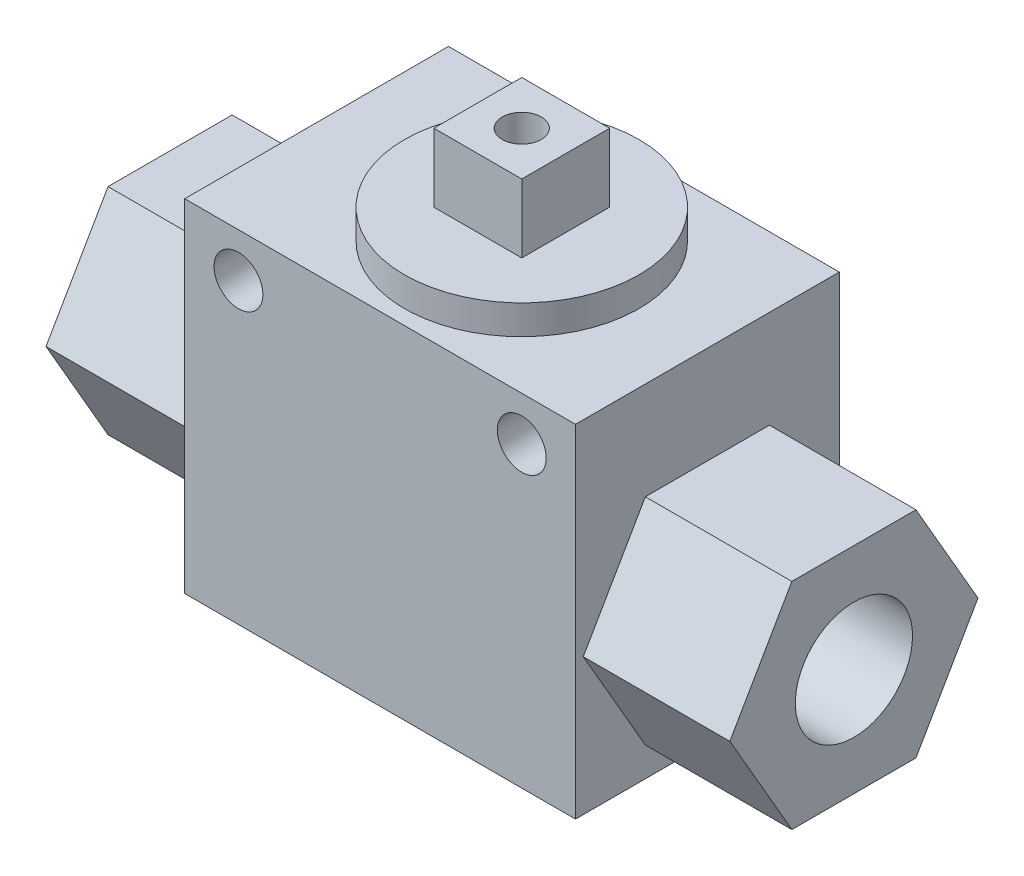
ISO-10303-21;
HEADER;
FILE_DESCRIPTION(('STEP AP214'),'2;1');
FILE_NAME('part.step','',(''),(''),'','','');
FILE_SCHEMA(('AUTOMOTIVE_DESIGN { 1 0 10303 214 1 1 1 1 }'));
ENDSEC;
DATA;
#1=APPLICATION_CONTEXT('core data for automotive mechanical design processes');
#2=APPLICATION_PROTOCOL_DEFINITION('international standard','automotive_design',2000,#1);
#3=PRODUCT_CONTEXT('',#1,'mechanical');
#4=PRODUCT('Part','Part','',(#3));
#5=PRODUCT_RELATED_PRODUCT_CATEGORY('part','',(#4));
#6=PRODUCT_DEFINITION_FORMATION('','',#4);
#7=PRODUCT_DEFINITION_CONTEXT('part definition',#1,'design');
#8=PRODUCT_DEFINITION('design','',#6,#7);
#9=PRODUCT_DEFINITION_SHAPE('','',#8);
#10=(LENGTH_UNIT() NAMED_UNIT(*) SI_UNIT(.MILLI.,.METRE.));
#11=(NAMED_UNIT(*) PLANE_ANGLE_UNIT() SI_UNIT($,.RADIAN.));
#12=(NAMED_UNIT(*) SI_UNIT($,.STERADIAN.) SOLID_ANGLE_UNIT());
#13=UNCERTAINTY_MEASURE_WITH_UNIT(LENGTH_MEASURE(1.E-05),#10,'distance_accuracy_value','');
#14=(GEOMETRIC_REPRESENTATION_CONTEXT(3) GLOBAL_UNCERTAINTY_ASSIGNED_CONTEXT((#13)) GLOBAL_UNIT_ASSIGNED_CONTEXT((#10,
#11,#12)) REPRESENTATION_CONTEXT('',''));
#15=CARTESIAN_POINT('',(0.,0.,0.));
#16=DIRECTION('',(0.,0.,1.));
#17=DIRECTION('',(1.,0.,0.));
#18=AXIS2_PLACEMENT_3D('',#15,#16,#17);
#19=CARTESIAN_POINT('',(0.,0.,-13.5));
#20=DIRECTION('',(-1.,0.,0.));
#21=DIRECTION('',(0.,-1.,0.));
#22=AXIS2_PLACEMENT_3D('',#19,#20,#21);
#23=PLANE('',#22);
#24=CARTESIAN_POINT('',(0.,14.,0.));
#25=DIRECTION('',(1.,0.,0.));
#26=DIRECTION('',(0.,0.,-1.));
#27=AXIS2_PLACEMENT_3D('',#24,#25,#26);
#28=CIRCLE('',#27,3.);
#29=CARTESIAN_POINT('',(0.,14.,-3.));
#30=VERTEX_POINT('',#29);
#31=EDGE_CURVE('E324',#30,#30,#28,.T.);
#32=ORIENTED_EDGE('',*,*,#31,.T.);
#33=EDGE_LOOP('',(#32));
#34=FACE_BOUND('',#33,.T.);
#35=CARTESIAN_POINT('',(0.,14.,0.));
#36=DIRECTION('',(1.,0.,0.));
#37=DIRECTION('',(0.,0.,-1.));
#38=AXIS2_PLACEMENT_3D('',#35,#36,#37);
#39=CIRCLE('',#38,6.);
#40=CARTESIAN_POINT('',(0.,14.,-6.));
#41=VERTEX_POINT('',#40);
#42=EDGE_CURVE('E54',#41,#41,#39,.T.);
#43=ORIENTED_EDGE('',*,*,#42,.F.);
#44=EDGE_LOOP('',(#43));
#45=FACE_BOUND('',#44,.T.);
#46=ADVANCED_FACE('F45',(#34,#45),#23,.T.);
#47=CARTESIAN_POINT('',(0.,0.,-13.5));
#48=DIRECTION('',(0.,-1.,0.));
#49=DIRECTION('',(0.,0.,-1.));
#50=AXIS2_PLACEMENT_3D('',#47,#48,#49);
#51=PLANE('',#50);
#52=DIRECTION('',(0.,0.,1.));
#53=VECTOR('',#52,1.);
#54=CARTESIAN_POINT('',(40.,0.,-13.5));
#55=LINE('',#54,#53);
#56=CARTESIAN_POINT('',(40.,0.,-13.5));
#57=VERTEX_POINT('',#56);
#58=CARTESIAN_POINT('',(40.,0.,13.5));
#59=VERTEX_POINT('',#58);
#60=EDGE_CURVE('E450',#57,#59,#55,.T.);
#61=ORIENTED_EDGE('',*,*,#60,.T.);
#62=DIRECTION('',(1.,0.,0.));
#63=VECTOR('',#62,1.);
#64=CARTESIAN_POINT('',(0.,0.,13.5));
#65=LINE('',#64,#63);
#66=CARTESIAN_POINT('',(0.,0.,13.5));
#67=VERTEX_POINT('',#66);
#68=EDGE_CURVE('E411',#67,#59,#65,.T.);
#69=ORIENTED_EDGE('',*,*,#68,.F.);
#70=DIRECTION('',(0.,0.,1.));
#71=VECTOR('',#70,1.);
#72=CARTESIAN_POINT('',(0.,0.,-13.5));
#73=LINE('',#72,#71);
#74=CARTESIAN_POINT('',(0.,0.,-13.5));
#75=VERTEX_POINT('',#74);
#76=EDGE_CURVE('E305',#75,#67,#73,.T.);
#77=ORIENTED_EDGE('',*,*,#76,.F.);
#78=DIRECTION('',(1.,0.,0.));
#79=VECTOR('',#78,1.);
#80=CARTESIAN_POINT('',(0.,0.,-13.5));
#81=LINE('',#80,#79);
#82=EDGE_CURVE('E435',#75,#57,#81,.T.);
#83=ORIENTED_EDGE('',*,*,#82,.T.);
#84=EDGE_LOOP('',(#61,#69,#77,#83));
#85=FACE_BOUND('',#84,.T.);
#86=ADVANCED_FACE('F462',(#85),#51,.T.);
#87=DIRECTION('',(0.,0.,1.));
#88=VECTOR('',#87,1.);
#89=CARTESIAN_POINT('',(0.,25.,0.));
#90=LINE('',#89,#88);
#91=CARTESIAN_POINT('',(0.,25.,-6.35085296108589));
#92=VERTEX_POINT('',#91);
#93=CARTESIAN_POINT('',(0.,25.,6.35085296108588));
#94=VERTEX_POINT('',#93);
#95=EDGE_CURVE('E256',#92,#94,#90,.T.);
#96=ORIENTED_EDGE('',*,*,#95,.T.);
#97=DIRECTION('',(0.,-0.866025403784439,0.5));
#98=VECTOR('',#97,1.);
#99=CARTESIAN_POINT('',(0.,9.,15.5884572681199));
#100=LINE('',#99,#98);
#101=CARTESIAN_POINT('',(0.,14.,12.7017059221718));
#102=VERTEX_POINT('',#101);
#103=EDGE_CURVE('E61',#94,#102,#100,.T.);
#104=ORIENTED_EDGE('',*,*,#103,.T.);
#105=DIRECTION('',(0.,-0.866025403784439,-0.5));
#106=VECTOR('',#105,1.);
#107=CARTESIAN_POINT('',(0.,-2.,3.46410161513775));
#108=LINE('',#107,#106);
#109=CARTESIAN_POINT('',(0.,3.,6.35085296108588));
#110=VERTEX_POINT('',#109);
#111=EDGE_CURVE('E283',#102,#110,#108,.T.);
#112=ORIENTED_EDGE('',*,*,#111,.T.);
#113=DIRECTION('',(0.,0.,-1.));
#114=VECTOR('',#113,1.);
#115=CARTESIAN_POINT('',(0.,3.,0.));
#116=LINE('',#115,#114);
#117=CARTESIAN_POINT('',(0.,3.,-6.35085296108588));
#118=VERTEX_POINT('',#117);
#119=EDGE_CURVE('E287',#110,#118,#116,.T.);
#120=ORIENTED_EDGE('',*,*,#119,.T.);
#121=DIRECTION('',(0.,0.866025403784439,-0.5));
#122=VECTOR('',#121,1.);
#123=CARTESIAN_POINT('',(0.,-2.,-3.46410161513775));
#124=LINE('',#123,#122);
#125=CARTESIAN_POINT('',(0.,14.,-12.7017059221718));
#126=VERTEX_POINT('',#125);
#127=EDGE_CURVE('E291',#118,#126,#124,.T.);
#128=ORIENTED_EDGE('',*,*,#127,.T.);
#129=DIRECTION('',(0.,0.866025403784439,0.5));
#130=VECTOR('',#129,1.);
#131=CARTESIAN_POINT('',(0.,9.,-15.5884572681199));
#132=LINE('',#131,#130);
#133=EDGE_CURVE('E295',#126,#92,#132,.T.);
#134=ORIENTED_EDGE('',*,*,#133,.T.);
#135=EDGE_LOOP('',(#96,#104,#112,#120,#128,#134));
#136=FACE_BOUND('',#135,.T.);
#137=ORIENTED_EDGE('',*,*,#76,.T.);
#138=DIRECTION('',(0.,-1.,0.));
#139=VECTOR('',#138,1.);
#140=CARTESIAN_POINT('',(0.,0.,13.5));
#141=LINE('',#140,#139);
#142=CARTESIAN_POINT('',(0.,35.,13.5));
#143=VERTEX_POINT('',#142);
#144=EDGE_CURVE('E423',#143,#67,#141,.T.);
#145=ORIENTED_EDGE('',*,*,#144,.F.);
#146=DIRECTION('',(0.,0.,1.));
#147=VECTOR('',#146,1.);
#148=CARTESIAN_POINT('',(0.,35.,-13.5));
#149=LINE('',#148,#147);
#150=CARTESIAN_POINT('',(0.,35.,-13.5));
#151=VERTEX_POINT('',#150);
#152=EDGE_CURVE('E453',#151,#143,#149,.T.);
#153=ORIENTED_EDGE('',*,*,#152,.F.);
#154=DIRECTION('',(0.,-1.,0.));
#155=VECTOR('',#154,1.);
#156=CARTESIAN_POINT('',(0.,0.,-13.5));
#157=LINE('',#156,#155);
#158=EDGE_CURVE('E446',#151,#75,#157,.T.);
#159=ORIENTED_EDGE('',*,*,#158,.T.);
#160=EDGE_LOOP('',(#137,#145,#153,#159));
#161=FACE_BOUND('',#160,.T.);
#162=ADVANCED_FACE('F473',(#136,#161),#23,.T.);
#163=CARTESIAN_POINT('',(0.,35.,-13.5));
#164=DIRECTION('',(0.,-1.,0.));
#165=DIRECTION('',(0.,0.,-1.));
#166=AXIS2_PLACEMENT_3D('',#163,#164,#165);
#167=PLANE('',#166);
#168=CARTESIAN_POINT('',(21.,35.,0.));
#169=DIRECTION('',(0.,-1.,0.));
#170=DIRECTION('',(0.,0.,-1.));
#171=AXIS2_PLACEMENT_3D('',#168,#169,#170);
#172=CIRCLE('',#171,12.);
#173=CARTESIAN_POINT('',(21.,35.,-12.));
#174=VERTEX_POINT('',#173);
#175=EDGE_CURVE('E11',#174,#174,#172,.F.);
#176=ORIENTED_EDGE('',*,*,#175,.F.);
#177=EDGE_LOOP('',(#176));
#178=FACE_BOUND('',#177,.T.);
#179=ORIENTED_EDGE('',*,*,#152,.T.);
#180=DIRECTION('',(1.,0.,0.));
#181=VECTOR('',#180,1.);
#182=CARTESIAN_POINT('',(0.,35.,13.5));
#183=LINE('',#182,#181);
#184=CARTESIAN_POINT('',(40.,35.,13.5));
#185=VERTEX_POINT('',#184);
#186=EDGE_CURVE('E419',#143,#185,#183,.T.);
#187=ORIENTED_EDGE('',*,*,#186,.T.);
#188=DIRECTION('',(0.,0.,1.));
#189=VECTOR('',#188,1.);
#190=CARTESIAN_POINT('',(40.,35.,-13.5));
#191=LINE('',#190,#189);
#192=CARTESIAN_POINT('',(40.,35.,-13.5));
#193=VERTEX_POINT('',#192);
#194=EDGE_CURVE('E456',#193,#185,#191,.T.);
#195=ORIENTED_EDGE('',*,*,#194,.F.);
#196=DIRECTION('',(1.,0.,0.));
#197=VECTOR('',#196,1.);
#198=CARTESIAN_POINT('',(0.,35.,-13.5));
#199=LINE('',#198,#197);
#200=EDGE_CURVE('E443',#151,#193,#199,.T.);
#201=ORIENTED_EDGE('',*,*,#200,.F.);
#202=EDGE_LOOP('',(#179,#187,#195,#201));
#203=FACE_BOUND('',#202,.T.);
#204=ADVANCED_FACE('F479',(#178,#203),#167,.F.);
#205=CARTESIAN_POINT('',(5.5,30.5,-13.5));
#206=DIRECTION('',(0.,0.,1.));
#207=DIRECTION('',(1.,0.,0.));
#208=AXIS2_PLACEMENT_3D('',#205,#206,#207);
#209=CYLINDRICAL_SURFACE('',#208,2.5);
#210=CARTESIAN_POINT('',(5.5,30.5,-13.5));
#211=DIRECTION('',(0.,0.,1.));
#212=DIRECTION('',(1.,0.,0.));
#213=AXIS2_PLACEMENT_3D('',#210,#211,#212);
#214=CIRCLE('',#213,2.5);
#215=CARTESIAN_POINT('',(8.,30.5,-13.5));
#216=VERTEX_POINT('',#215);
#217=EDGE_CURVE('E431',#216,#216,#214,.T.);
#218=ORIENTED_EDGE('',*,*,#217,.F.);
#219=EDGE_LOOP('',(#218));
#220=FACE_BOUND('',#219,.T.);
#221=CARTESIAN_POINT('',(5.5,30.5,13.5));
#222=DIRECTION('',(0.,0.,1.));
#223=DIRECTION('',(1.,0.,0.));
#224=AXIS2_PLACEMENT_3D('',#221,#222,#223);
#225=CIRCLE('',#224,2.5);
#226=CARTESIAN_POINT('',(8.,30.5,13.5));
#227=VERTEX_POINT('',#226);
#228=EDGE_CURVE('E407',#227,#227,#225,.T.);
#229=ORIENTED_EDGE('',*,*,#228,.T.);
#230=EDGE_LOOP('',(#229));
#231=FACE_BOUND('',#230,.T.);
#232=ADVANCED_FACE('F481',(#220,#231),#209,.F.);
#233=CARTESIAN_POINT('',(34.5,30.5,-13.5));
#234=DIRECTION('',(0.,0.,1.));
#235=DIRECTION('',(1.,0.,0.));
#236=AXIS2_PLACEMENT_3D('',#233,#234,#235);
#237=CYLINDRICAL_SURFACE('',#236,2.5);
#238=CARTESIAN_POINT('',(34.5,30.5,-13.5));
#239=DIRECTION('',(0.,0.,1.));
#240=DIRECTION('',(1.,0.,0.));
#241=AXIS2_PLACEMENT_3D('',#238,#239,#240);
#242=CIRCLE('',#241,2.5);
#243=CARTESIAN_POINT('',(37.,30.5,-13.5));
#244=VERTEX_POINT('',#243);
#245=EDGE_CURVE('E427',#244,#244,#242,.T.);
#246=ORIENTED_EDGE('',*,*,#245,.F.);
#247=EDGE_LOOP('',(#246));
#248=FACE_BOUND('',#247,.T.);
#249=CARTESIAN_POINT('',(34.5,30.5,13.5));
#250=DIRECTION('',(0.,0.,1.));
#251=DIRECTION('',(1.,0.,0.));
#252=AXIS2_PLACEMENT_3D('',#249,#250,#251);
#253=CIRCLE('',#252,2.5);
#254=CARTESIAN_POINT('',(37.,30.5,13.5));
#255=VERTEX_POINT('',#254);
#256=EDGE_CURVE('E403',#255,#255,#253,.T.);
#257=ORIENTED_EDGE('',*,*,#256,.T.);
#258=EDGE_LOOP('',(#257));
#259=FACE_BOUND('',#258,.T.);
#260=ADVANCED_FACE('F47',(#248,#259),#237,.F.);
#261=CARTESIAN_POINT('',(40.,0.,-13.5));
#262=DIRECTION('',(1.,0.,0.));
#263=DIRECTION('',(0.,0.,-1.));
#264=AXIS2_PLACEMENT_3D('',#261,#262,#263);
#265=PLANE('',#264);
#266=DIRECTION('',(0.,-0.866025403784439,0.5));
#267=VECTOR('',#266,1.);
#268=CARTESIAN_POINT('',(40.,9.,15.5884572681199));
#269=LINE('',#268,#267);
#270=CARTESIAN_POINT('',(40.,25.,6.35085296108588));
#271=VERTEX_POINT('',#270);
#272=CARTESIAN_POINT('',(40.,14.,12.7017059221718));
#273=VERTEX_POINT('',#272);
#274=EDGE_CURVE('E69',#271,#273,#269,.T.);
#275=ORIENTED_EDGE('',*,*,#274,.F.);
#276=DIRECTION('',(0.,0.,1.));
#277=VECTOR('',#276,1.);
#278=CARTESIAN_POINT('',(40.,25.,0.));
#279=LINE('',#278,#277);
#280=CARTESIAN_POINT('',(40.,25.,-6.35085296108589));
#281=VERTEX_POINT('',#280);
#282=EDGE_CURVE('E374',#281,#271,#279,.T.);
#283=ORIENTED_EDGE('',*,*,#282,.F.);
#284=DIRECTION('',(0.,0.866025403784439,0.5));
#285=VECTOR('',#284,1.);
#286=CARTESIAN_POINT('',(40.,9.,-15.5884572681199));
#287=LINE('',#286,#285);
#288=CARTESIAN_POINT('',(40.,14.,-12.7017059221718));
#289=VERTEX_POINT('',#288);
#290=EDGE_CURVE('E370',#289,#281,#287,.T.);
#291=ORIENTED_EDGE('',*,*,#290,.F.);
#292=DIRECTION('',(0.,0.866025403784439,-0.5));
#293=VECTOR('',#292,1.);
#294=CARTESIAN_POINT('',(40.,-2.,-3.46410161513775));
#295=LINE('',#294,#293);
#296=CARTESIAN_POINT('',(40.,3.,-6.35085296108588));
#297=VERTEX_POINT('',#296);
#298=EDGE_CURVE('E366',#297,#289,#295,.T.);
#299=ORIENTED_EDGE('',*,*,#298,.F.);
#300=DIRECTION('',(0.,0.,-1.));
#301=VECTOR('',#300,1.);
#302=CARTESIAN_POINT('',(40.,3.,0.));
#303=LINE('',#302,#301);
#304=CARTESIAN_POINT('',(40.,3.,6.35085296108588));
#305=VERTEX_POINT('',#304);
#306=EDGE_CURVE('E362',#305,#297,#303,.T.);
#307=ORIENTED_EDGE('',*,*,#306,.F.);
#308=DIRECTION('',(0.,-0.866025403784439,-0.5));
#309=VECTOR('',#308,1.);
#310=CARTESIAN_POINT('',(40.,-2.,3.46410161513775));
#311=LINE('',#310,#309);
#312=EDGE_CURVE('E358',#273,#305,#311,.T.);
#313=ORIENTED_EDGE('',*,*,#312,.F.);
#314=EDGE_LOOP('',(#275,#283,#291,#299,#307,#313));
#315=FACE_BOUND('',#314,.T.);
#316=ORIENTED_EDGE('',*,*,#194,.T.);
#317=DIRECTION('',(0.,1.,0.));
#318=VECTOR('',#317,1.);
#319=CARTESIAN_POINT('',(40.,0.,13.5));
#320=LINE('',#319,#318);
#321=EDGE_CURVE('E415',#59,#185,#320,.T.);
#322=ORIENTED_EDGE('',*,*,#321,.F.);
#323=ORIENTED_EDGE('',*,*,#60,.F.);
#324=DIRECTION('',(0.,1.,0.));
#325=VECTOR('',#324,1.);
#326=CARTESIAN_POINT('',(40.,0.,-13.5));
#327=LINE('',#326,#325);
#328=EDGE_CURVE('E439',#57,#193,#327,.T.);
#329=ORIENTED_EDGE('',*,*,#328,.T.);
#330=EDGE_LOOP('',(#316,#322,#323,#329));
#331=FACE_BOUND('',#330,.T.);
#332=ADVANCED_FACE('F466',(#315,#331),#265,.T.);
#333=CARTESIAN_POINT('',(0.,0.,-13.5));
#334=DIRECTION('',(0.,0.,1.));
#335=DIRECTION('',(1.,0.,0.));
#336=AXIS2_PLACEMENT_3D('',#333,#334,#335);
#337=PLANE('',#336);
#338=ORIENTED_EDGE('',*,*,#245,.T.);
#339=EDGE_LOOP('',(#338));
#340=FACE_BOUND('',#339,.T.);
#341=ORIENTED_EDGE('',*,*,#217,.T.);
#342=EDGE_LOOP('',(#341));
#343=FACE_BOUND('',#342,.T.);
#344=ORIENTED_EDGE('',*,*,#82,.F.);
#345=ORIENTED_EDGE('',*,*,#158,.F.);
#346=ORIENTED_EDGE('',*,*,#200,.T.);
#347=ORIENTED_EDGE('',*,*,#328,.F.);
#348=EDGE_LOOP('',(#344,#345,#346,#347));
#349=FACE_BOUND('',#348,.T.);
#350=ADVANCED_FACE('F477',(#340,#343,#349),#337,.F.);
#351=CARTESIAN_POINT('',(0.,0.,13.5));
#352=DIRECTION('',(0.,0.,1.));
#353=DIRECTION('',(1.,0.,0.));
#354=AXIS2_PLACEMENT_3D('',#351,#352,#353);
#355=PLANE('',#354);
#356=ORIENTED_EDGE('',*,*,#256,.F.);
#357=EDGE_LOOP('',(#356));
#358=FACE_BOUND('',#357,.T.);
#359=ORIENTED_EDGE('',*,*,#228,.F.);
#360=EDGE_LOOP('',(#359));
#361=FACE_BOUND('',#360,.T.);
#362=ORIENTED_EDGE('',*,*,#68,.T.);
#363=ORIENTED_EDGE('',*,*,#321,.T.);
#364=ORIENTED_EDGE('',*,*,#186,.F.);
#365=ORIENTED_EDGE('',*,*,#144,.T.);
#366=EDGE_LOOP('',(#362,#363,#364,#365));
#367=FACE_BOUND('',#366,.T.);
#368=ADVANCED_FACE('F470',(#358,#361,#367),#355,.T.);
#369=CARTESIAN_POINT('',(55.,9.,15.5884572681199));
#370=DIRECTION('',(0.,-0.5,-0.866025403784439));
#371=DIRECTION('',(0.,0.866025403784439,-0.5));
#372=AXIS2_PLACEMENT_3D('',#369,#370,#371);
#373=PLANE('',#372);
#374=ORIENTED_EDGE('',*,*,#274,.T.);
#375=DIRECTION('',(-1.,0.,0.));
#376=VECTOR('',#375,1.);
#377=CARTESIAN_POINT('',(55.,14.,12.7017059221718));
#378=LINE('',#377,#376);
#379=CARTESIAN_POINT('',(55.,14.,12.7017059221718));
#380=VERTEX_POINT('',#379);
#381=EDGE_CURVE('E399',#380,#273,#378,.T.);
#382=ORIENTED_EDGE('',*,*,#381,.F.);
#383=DIRECTION('',(0.,-0.866025403784439,0.5));
#384=VECTOR('',#383,1.);
#385=CARTESIAN_POINT('',(55.,9.,15.5884572681199));
#386=LINE('',#385,#384);
#387=CARTESIAN_POINT('',(55.,25.,6.35085296108588));
#388=VERTEX_POINT('',#387);
#389=EDGE_CURVE('E331',#388,#380,#386,.T.);
#390=ORIENTED_EDGE('',*,*,#389,.F.);
#391=DIRECTION('',(-1.,0.,0.));
#392=VECTOR('',#391,1.);
#393=CARTESIAN_POINT('',(55.,25.,6.35085296108588));
#394=LINE('',#393,#392);
#395=EDGE_CURVE('E355',#388,#271,#394,.T.);
#396=ORIENTED_EDGE('',*,*,#395,.T.);
#397=EDGE_LOOP('',(#374,#382,#390,#396));
#398=FACE_BOUND('',#397,.T.);
#399=ADVANCED_FACE('F509',(#398),#373,.F.);
#400=CARTESIAN_POINT('',(55.,-2.,3.46410161513775));
#401=DIRECTION('',(0.,0.5,-0.866025403784439));
#402=DIRECTION('',(0.,0.866025403784439,0.5));
#403=AXIS2_PLACEMENT_3D('',#400,#401,#402);
#404=PLANE('',#403);
#405=ORIENTED_EDGE('',*,*,#312,.T.);
#406=DIRECTION('',(-1.,0.,0.));
#407=VECTOR('',#406,1.);
#408=CARTESIAN_POINT('',(55.,3.,6.35085296108588));
#409=LINE('',#408,#407);
#410=CARTESIAN_POINT('',(55.,3.,6.35085296108588));
#411=VERTEX_POINT('',#410);
#412=EDGE_CURVE('E395',#411,#305,#409,.T.);
#413=ORIENTED_EDGE('',*,*,#412,.F.);
#414=DIRECTION('',(0.,-0.866025403784439,-0.5));
#415=VECTOR('',#414,1.);
#416=CARTESIAN_POINT('',(55.,-2.,3.46410161513775));
#417=LINE('',#416,#415);
#418=EDGE_CURVE('E335',#380,#411,#417,.T.);
#419=ORIENTED_EDGE('',*,*,#418,.F.);
#420=ORIENTED_EDGE('',*,*,#381,.T.);
#421=EDGE_LOOP('',(#405,#413,#419,#420));
#422=FACE_BOUND('',#421,.T.);
#423=ADVANCED_FACE('F513',(#422),#404,.F.);
#424=CARTESIAN_POINT('',(55.,3.,0.));
#425=DIRECTION('',(0.,1.,0.));
#426=DIRECTION('',(0.,0.,1.));
#427=AXIS2_PLACEMENT_3D('',#424,#425,#426);
#428=PLANE('',#427);
#429=ORIENTED_EDGE('',*,*,#306,.T.);
#430=DIRECTION('',(-1.,0.,0.));
#431=VECTOR('',#430,1.);
#432=CARTESIAN_POINT('',(55.,3.,-6.35085296108588));
#433=LINE('',#432,#431);
#434=CARTESIAN_POINT('',(55.,3.,-6.35085296108588));
#435=VERTEX_POINT('',#434);
#436=EDGE_CURVE('E391',#435,#297,#433,.T.);
#437=ORIENTED_EDGE('',*,*,#436,.F.);
#438=DIRECTION('',(0.,0.,-1.));
#439=VECTOR('',#438,1.);
#440=CARTESIAN_POINT('',(55.,3.,0.));
#441=LINE('',#440,#439);
#442=EDGE_CURVE('E339',#411,#435,#441,.T.);
#443=ORIENTED_EDGE('',*,*,#442,.F.);
#444=ORIENTED_EDGE('',*,*,#412,.T.);
#445=EDGE_LOOP('',(#429,#437,#443,#444));
#446=FACE_BOUND('',#445,.T.);
#447=ADVANCED_FACE('F517',(#446),#428,.F.);
#448=CARTESIAN_POINT('',(55.,-2.,-3.46410161513775));
#449=DIRECTION('',(0.,0.5,0.866025403784439));
#450=DIRECTION('',(0.,-0.866025403784439,0.5));
#451=AXIS2_PLACEMENT_3D('',#448,#449,#450);
#452=PLANE('',#451);
#453=ORIENTED_EDGE('',*,*,#298,.T.);
#454=DIRECTION('',(-1.,0.,0.));
#455=VECTOR('',#454,1.);
#456=CARTESIAN_POINT('',(55.,14.,-12.7017059221718));
#457=LINE('',#456,#455);
#458=CARTESIAN_POINT('',(55.,14.,-12.7017059221718));
#459=VERTEX_POINT('',#458);
#460=EDGE_CURVE('E387',#459,#289,#457,.T.);
#461=ORIENTED_EDGE('',*,*,#460,.F.);
#462=DIRECTION('',(0.,0.866025403784439,-0.5));
#463=VECTOR('',#462,1.);
#464=CARTESIAN_POINT('',(55.,-2.,-3.46410161513775));
#465=LINE('',#464,#463);
#466=EDGE_CURVE('E342',#435,#459,#465,.T.);
#467=ORIENTED_EDGE('',*,*,#466,.F.);
#468=ORIENTED_EDGE('',*,*,#436,.T.);
#469=EDGE_LOOP('',(#453,#461,#467,#468));
#470=FACE_BOUND('',#469,.T.);
#471=ADVANCED_FACE('F521',(#470),#452,.F.);
#472=CARTESIAN_POINT('',(55.,9.,-15.5884572681199));
#473=DIRECTION('',(0.,-0.5,0.866025403784439));
#474=DIRECTION('',(0.,-0.866025403784439,-0.5));
#475=AXIS2_PLACEMENT_3D('',#472,#473,#474);
#476=PLANE('',#475);
#477=ORIENTED_EDGE('',*,*,#290,.T.);
#478=DIRECTION('',(-1.,0.,0.));
#479=VECTOR('',#478,1.);
#480=CARTESIAN_POINT('',(55.,25.,-6.35085296108589));
#481=LINE('',#480,#479);
#482=CARTESIAN_POINT('',(55.,25.,-6.35085296108589));
#483=VERTEX_POINT('',#482);
#484=EDGE_CURVE('E383',#483,#281,#481,.T.);
#485=ORIENTED_EDGE('',*,*,#484,.F.);
#486=DIRECTION('',(0.,0.866025403784439,0.5));
#487=VECTOR('',#486,1.);
#488=CARTESIAN_POINT('',(55.,9.,-15.5884572681199));
#489=LINE('',#488,#487);
#490=EDGE_CURVE('E345',#459,#483,#489,.T.);
#491=ORIENTED_EDGE('',*,*,#490,.F.);
#492=ORIENTED_EDGE('',*,*,#460,.T.);
#493=EDGE_LOOP('',(#477,#485,#491,#492));
#494=FACE_BOUND('',#493,.T.);
#495=ADVANCED_FACE('F525',(#494),#476,.F.);
#496=CARTESIAN_POINT('',(55.,25.,0.));
#497=DIRECTION('',(0.,-1.,0.));
#498=DIRECTION('',(0.,0.,-1.));
#499=AXIS2_PLACEMENT_3D('',#496,#497,#498);
#500=PLANE('',#499);
#501=ORIENTED_EDGE('',*,*,#282,.T.);
#502=ORIENTED_EDGE('',*,*,#395,.F.);
#503=DIRECTION('',(0.,0.,1.));
#504=VECTOR('',#503,1.);
#505=CARTESIAN_POINT('',(55.,25.,0.));
#506=LINE('',#505,#504);
#507=EDGE_CURVE('E348',#483,#388,#506,.T.);
#508=ORIENTED_EDGE('',*,*,#507,.F.);
#509=ORIENTED_EDGE('',*,*,#484,.T.);
#510=EDGE_LOOP('',(#501,#502,#508,#509));
#511=FACE_BOUND('',#510,.T.);
#512=ADVANCED_FACE('F529',(#511),#500,.F.);
#513=CARTESIAN_POINT('',(55.,14.,0.));
#514=DIRECTION('',(-1.,0.,0.));
#515=DIRECTION('',(0.,0.,1.));
#516=AXIS2_PLACEMENT_3D('',#513,#514,#515);
#517=CYLINDRICAL_SURFACE('',#516,6.);
#518=CARTESIAN_POINT('',(55.,14.,0.));
#519=DIRECTION('',(1.,0.,0.));
#520=DIRECTION('',(0.,0.,-1.));
#521=AXIS2_PLACEMENT_3D('',#518,#519,#520);
#522=CIRCLE('',#521,6.);
#523=CARTESIAN_POINT('',(55.,14.,-6.));
#524=VERTEX_POINT('',#523);
#525=EDGE_CURVE('E351',#524,#524,#522,.T.);
#526=ORIENTED_EDGE('',*,*,#525,.T.);
#527=EDGE_LOOP('',(#526));
#528=FACE_BOUND('',#527,.T.);
#529=CARTESIAN_POINT('',(40.,14.,0.));
#530=DIRECTION('',(1.,0.,0.));
#531=DIRECTION('',(0.,0.,-1.));
#532=AXIS2_PLACEMENT_3D('',#529,#530,#531);
#533=CIRCLE('',#532,6.);
#534=CARTESIAN_POINT('',(40.,14.,-6.));
#535=VERTEX_POINT('',#534);
#536=EDGE_CURVE('E336',#535,#535,#533,.T.);
#537=ORIENTED_EDGE('',*,*,#536,.F.);
#538=EDGE_LOOP('',(#537));
#539=FACE_BOUND('',#538,.T.);
#540=ADVANCED_FACE('F533',(#528,#539),#517,.F.);
#541=CARTESIAN_POINT('',(55.,0.,0.));
#542=DIRECTION('',(1.,0.,0.));
#543=DIRECTION('',(0.,0.,-1.));
#544=AXIS2_PLACEMENT_3D('',#541,#542,#543);
#545=PLANE('',#544);
#546=ORIENTED_EDGE('',*,*,#389,.T.);
#547=ORIENTED_EDGE('',*,*,#418,.T.);
#548=ORIENTED_EDGE('',*,*,#442,.T.);
#549=ORIENTED_EDGE('',*,*,#466,.T.);
#550=ORIENTED_EDGE('',*,*,#490,.T.);
#551=ORIENTED_EDGE('',*,*,#507,.T.);
#552=EDGE_LOOP('',(#546,#547,#548,#549,#550,#551));
#553=FACE_BOUND('',#552,.T.);
#554=ORIENTED_EDGE('',*,*,#525,.F.);
#555=EDGE_LOOP('',(#554));
#556=FACE_BOUND('',#555,.T.);
#557=ADVANCED_FACE('F537',(#553,#556),#545,.T.);
#558=CARTESIAN_POINT('',(40.,14.,0.));
#559=DIRECTION('',(1.,0.,0.));
#560=DIRECTION('',(0.,0.,-1.));
#561=AXIS2_PLACEMENT_3D('',#558,#559,#560);
#562=CIRCLE('',#561,3.);
#563=CARTESIAN_POINT('',(40.,14.,-3.));
#564=VERTEX_POINT('',#563);
#565=EDGE_CURVE('E309',#564,#564,#562,.T.);
#566=ORIENTED_EDGE('',*,*,#565,.F.);
#567=EDGE_LOOP('',(#566));
#568=FACE_BOUND('',#567,.T.);
#569=ORIENTED_EDGE('',*,*,#536,.T.);
#570=EDGE_LOOP('',(#569));
#571=FACE_BOUND('',#570,.T.);
#572=ADVANCED_FACE('F541',(#568,#571),#265,.T.);
#573=CARTESIAN_POINT('',(0.,14.,0.));
#574=DIRECTION('',(1.,0.,0.));
#575=DIRECTION('',(0.,0.,-1.));
#576=AXIS2_PLACEMENT_3D('',#573,#574,#575);
#577=CYLINDRICAL_SURFACE('',#576,3.);
#578=ORIENTED_EDGE('',*,*,#31,.F.);
#579=EDGE_LOOP('',(#578));
#580=FACE_BOUND('',#579,.T.);
#581=ORIENTED_EDGE('',*,*,#565,.T.);
#582=EDGE_LOOP('',(#581));
#583=FACE_BOUND('',#582,.T.);
#584=ADVANCED_FACE('F543',(#580,#583),#577,.F.);
#585=CARTESIAN_POINT('',(-15.,9.,15.5884572681199));
#586=DIRECTION('',(0.,0.5,0.866025403784439));
#587=DIRECTION('',(0.,-0.866025403784439,0.5));
#588=AXIS2_PLACEMENT_3D('',#585,#586,#587);
#589=PLANE('',#588);
#590=ORIENTED_EDGE('',*,*,#103,.F.);
#591=DIRECTION('',(1.,0.,0.));
#592=VECTOR('',#591,1.);
#593=CARTESIAN_POINT('',(-15.,25.,6.35085296108588));
#594=LINE('',#593,#592);
#595=CARTESIAN_POINT('',(-15.,25.,6.35085296108588));
#596=VERTEX_POINT('',#595);
#597=EDGE_CURVE('E306',#596,#94,#594,.T.);
#598=ORIENTED_EDGE('',*,*,#597,.F.);
#599=DIRECTION('',(0.,-0.866025403784439,0.5));
#600=VECTOR('',#599,1.);
#601=CARTESIAN_POINT('',(-15.,9.,15.5884572681199));
#602=LINE('',#601,#600);
#603=CARTESIAN_POINT('',(-15.,14.,12.7017059221718));
#604=VERTEX_POINT('',#603);
#605=EDGE_CURVE('E251',#596,#604,#602,.T.);
#606=ORIENTED_EDGE('',*,*,#605,.T.);
#607=DIRECTION('',(1.,0.,0.));
#608=VECTOR('',#607,1.);
#609=CARTESIAN_POINT('',(-15.,14.,12.7017059221718));
#610=LINE('',#609,#608);
#611=EDGE_CURVE('E280',#604,#102,#610,.T.);
#612=ORIENTED_EDGE('',*,*,#611,.T.);
#613=EDGE_LOOP('',(#590,#598,#606,#612));
#614=FACE_BOUND('',#613,.T.);
#615=ADVANCED_FACE('F546',(#614),#589,.T.);
#616=CARTESIAN_POINT('',(-15.,25.,0.));
#617=DIRECTION('',(0.,1.,0.));
#618=DIRECTION('',(0.,0.,1.));
#619=AXIS2_PLACEMENT_3D('',#616,#617,#618);
#620=PLANE('',#619);
#621=ORIENTED_EDGE('',*,*,#95,.F.);
#622=DIRECTION('',(1.,0.,0.));
#623=VECTOR('',#622,1.);
#624=CARTESIAN_POINT('',(-15.,25.,-6.35085296108589));
#625=LINE('',#624,#623);
#626=CARTESIAN_POINT('',(-15.,25.,-6.35085296108589));
#627=VERTEX_POINT('',#626);
#628=EDGE_CURVE('E310',#627,#92,#625,.T.);
#629=ORIENTED_EDGE('',*,*,#628,.F.);
#630=DIRECTION('',(0.,0.,1.));
#631=VECTOR('',#630,1.);
#632=CARTESIAN_POINT('',(-15.,25.,0.));
#633=LINE('',#632,#631);
#634=EDGE_CURVE('E272',#627,#596,#633,.T.);
#635=ORIENTED_EDGE('',*,*,#634,.T.);
#636=ORIENTED_EDGE('',*,*,#597,.T.);
#637=EDGE_LOOP('',(#621,#629,#635,#636));
#638=FACE_BOUND('',#637,.T.);
#639=ADVANCED_FACE('F550',(#638),#620,.T.);
#640=CARTESIAN_POINT('',(-15.,9.,-15.5884572681199));
#641=DIRECTION('',(0.,0.5,-0.866025403784439));
#642=DIRECTION('',(0.,0.866025403784439,0.5));
#643=AXIS2_PLACEMENT_3D('',#640,#641,#642);
#644=PLANE('',#643);
#645=ORIENTED_EDGE('',*,*,#133,.F.);
#646=DIRECTION('',(1.,0.,0.));
#647=VECTOR('',#646,1.);
#648=CARTESIAN_POINT('',(-15.,14.,-12.7017059221718));
#649=LINE('',#648,#647);
#650=CARTESIAN_POINT('',(-15.,14.,-12.7017059221718));
#651=VERTEX_POINT('',#650);
#652=EDGE_CURVE('E313',#651,#126,#649,.T.);
#653=ORIENTED_EDGE('',*,*,#652,.F.);
#654=DIRECTION('',(0.,0.866025403784439,0.5));
#655=VECTOR('',#654,1.);
#656=CARTESIAN_POINT('',(-15.,9.,-15.5884572681199));
#657=LINE('',#656,#655);
#658=EDGE_CURVE('E268',#651,#627,#657,.T.);
#659=ORIENTED_EDGE('',*,*,#658,.T.);
#660=ORIENTED_EDGE('',*,*,#628,.T.);
#661=EDGE_LOOP('',(#645,#653,#659,#660));
#662=FACE_BOUND('',#661,.T.);
#663=ADVANCED_FACE('F563',(#662),#644,.T.);
#664=CARTESIAN_POINT('',(-15.,-2.,-3.46410161513775));
#665=DIRECTION('',(0.,-0.5,-0.866025403784439));
#666=DIRECTION('',(0.,0.866025403784439,-0.5));
#667=AXIS2_PLACEMENT_3D('',#664,#665,#666);
#668=PLANE('',#667);
#669=ORIENTED_EDGE('',*,*,#127,.F.);
#670=DIRECTION('',(1.,0.,0.));
#671=VECTOR('',#670,1.);
#672=CARTESIAN_POINT('',(-15.,3.,-6.35085296108588));
#673=LINE('',#672,#671);
#674=CARTESIAN_POINT('',(-15.,3.,-6.35085296108588));
#675=VERTEX_POINT('',#674);
#676=EDGE_CURVE('E316',#675,#118,#673,.T.);
#677=ORIENTED_EDGE('',*,*,#676,.F.);
#678=DIRECTION('',(0.,0.866025403784439,-0.5));
#679=VECTOR('',#678,1.);
#680=CARTESIAN_POINT('',(-15.,-2.,-3.46410161513775));
#681=LINE('',#680,#679);
#682=EDGE_CURVE('E264',#675,#651,#681,.T.);
#683=ORIENTED_EDGE('',*,*,#682,.T.);
#684=ORIENTED_EDGE('',*,*,#652,.T.);
#685=EDGE_LOOP('',(#669,#677,#683,#684));
#686=FACE_BOUND('',#685,.T.);
#687=ADVANCED_FACE('F559',(#686),#668,.T.);
#688=CARTESIAN_POINT('',(-15.,3.,0.));
#689=DIRECTION('',(0.,-1.,0.));
#690=DIRECTION('',(0.,0.,-1.));
#691=AXIS2_PLACEMENT_3D('',#688,#689,#690);
#692=PLANE('',#691);
#693=ORIENTED_EDGE('',*,*,#119,.F.);
#694=DIRECTION('',(1.,0.,0.));
#695=VECTOR('',#694,1.);
#696=CARTESIAN_POINT('',(-15.,3.,6.35085296108588));
#697=LINE('',#696,#695);
#698=CARTESIAN_POINT('',(-15.,3.,6.35085296108588));
#699=VERTEX_POINT('',#698);
#700=EDGE_CURVE('E319',#699,#110,#697,.T.);
#701=ORIENTED_EDGE('',*,*,#700,.F.);
#702=DIRECTION('',(0.,0.,-1.));
#703=VECTOR('',#702,1.);
#704=CARTESIAN_POINT('',(-15.,3.,0.));
#705=LINE('',#704,#703);
#706=EDGE_CURVE('E260',#699,#675,#705,.T.);
#707=ORIENTED_EDGE('',*,*,#706,.T.);
#708=ORIENTED_EDGE('',*,*,#676,.T.);
#709=EDGE_LOOP('',(#693,#701,#707,#708));
#710=FACE_BOUND('',#709,.T.);
#711=ADVANCED_FACE('F555',(#710),#692,.T.);
#712=CARTESIAN_POINT('',(-15.,-2.,3.46410161513775));
#713=DIRECTION('',(0.,-0.5,0.866025403784439));
#714=DIRECTION('',(0.,-0.866025403784439,-0.5));
#715=AXIS2_PLACEMENT_3D('',#712,#713,#714);
#716=PLANE('',#715);
#717=ORIENTED_EDGE('',*,*,#111,.F.);
#718=ORIENTED_EDGE('',*,*,#611,.F.);
#719=DIRECTION('',(0.,-0.866025403784439,-0.5));
#720=VECTOR('',#719,1.);
#721=CARTESIAN_POINT('',(-15.,-2.,3.46410161513775));
#722=LINE('',#721,#720);
#723=EDGE_CURVE('E255',#604,#699,#722,.T.);
#724=ORIENTED_EDGE('',*,*,#723,.T.);
#725=ORIENTED_EDGE('',*,*,#700,.T.);
#726=EDGE_LOOP('',(#717,#718,#724,#725));
#727=FACE_BOUND('',#726,.T.);
#728=ADVANCED_FACE('F551',(#727),#716,.T.);
#729=CARTESIAN_POINT('',(-15.,14.,0.));
#730=DIRECTION('',(1.,0.,0.));
#731=DIRECTION('',(0.,0.,-1.));
#732=AXIS2_PLACEMENT_3D('',#729,#730,#731);
#733=CYLINDRICAL_SURFACE('',#732,6.);
#734=CARTESIAN_POINT('',(-15.,14.,0.));
#735=DIRECTION('',(1.,0.,0.));
#736=DIRECTION('',(0.,0.,-1.));
#737=AXIS2_PLACEMENT_3D('',#734,#735,#736);
#738=CIRCLE('',#737,6.);
#739=CARTESIAN_POINT('',(-15.,14.,-6.));
#740=VERTEX_POINT('',#739);
#741=EDGE_CURVE('E276',#740,#740,#738,.T.);
#742=ORIENTED_EDGE('',*,*,#741,.F.);
#743=EDGE_LOOP('',(#742));
#744=FACE_BOUND('',#743,.T.);
#745=ORIENTED_EDGE('',*,*,#42,.T.);
#746=EDGE_LOOP('',(#745));
#747=FACE_BOUND('',#746,.T.);
#748=ADVANCED_FACE('F554',(#744,#747),#733,.F.);
#749=CARTESIAN_POINT('',(-15.,0.,0.));
#750=DIRECTION('',(1.,0.,0.));
#751=DIRECTION('',(0.,0.,-1.));
#752=AXIS2_PLACEMENT_3D('',#749,#750,#751);
#753=PLANE('',#752);
#754=ORIENTED_EDGE('',*,*,#605,.F.);
#755=ORIENTED_EDGE('',*,*,#634,.F.);
#756=ORIENTED_EDGE('',*,*,#658,.F.);
#757=ORIENTED_EDGE('',*,*,#682,.F.);
#758=ORIENTED_EDGE('',*,*,#706,.F.);
#759=ORIENTED_EDGE('',*,*,#723,.F.);
#760=EDGE_LOOP('',(#754,#755,#756,#757,#758,#759));
#761=FACE_BOUND('',#760,.T.);
#762=ORIENTED_EDGE('',*,*,#741,.T.);
#763=EDGE_LOOP('',(#762));
#764=FACE_BOUND('',#763,.T.);
#765=ADVANCED_FACE('F573',(#761,#764),#753,.F.);
#766=CARTESIAN_POINT('',(21.,38.,0.));
#767=DIRECTION('',(0.,-1.,0.));
#768=DIRECTION('',(0.,0.,-1.));
#769=AXIS2_PLACEMENT_3D('',#766,#767,#768);
#770=CYLINDRICAL_SURFACE('',#769,12.);
#771=CARTESIAN_POINT('',(21.,38.,0.));
#772=DIRECTION('',(0.,1.,0.));
#773=DIRECTION('',(0.,0.,1.));
#774=AXIS2_PLACEMENT_3D('',#771,#772,#773);
#775=CIRCLE('',#774,12.);
#776=CARTESIAN_POINT('',(21.,38.,12.));
#777=VERTEX_POINT('',#776);
#778=EDGE_CURVE('E247',#777,#777,#775,.T.);
#779=ORIENTED_EDGE('',*,*,#778,.F.);
#780=EDGE_LOOP('',(#779));
#781=FACE_BOUND('',#780,.T.);
#782=ORIENTED_EDGE('',*,*,#175,.T.);
#783=EDGE_LOOP('',(#782));
#784=FACE_BOUND('',#783,.T.);
#785=ADVANCED_FACE('F577',(#781,#784),#770,.T.);
#786=CARTESIAN_POINT('',(0.,38.,0.));
#787=DIRECTION('',(0.,1.,0.));
#788=DIRECTION('',(0.,0.,1.));
#789=AXIS2_PLACEMENT_3D('',#786,#787,#788);
#790=PLANE('',#789);
#791=DIRECTION('',(1.,0.,0.));
#792=VECTOR('',#791,1.);
#793=CARTESIAN_POINT('',(0.,38.,4.5));
#794=LINE('',#793,#792);
#795=CARTESIAN_POINT('',(16.5,38.,4.5));
#796=VERTEX_POINT('',#795);
#797=CARTESIAN_POINT('',(25.5,38.,4.5));
#798=VERTEX_POINT('',#797);
#799=EDGE_CURVE('E203',#796,#798,#794,.T.);
#800=ORIENTED_EDGE('',*,*,#799,.F.);
#801=DIRECTION('',(0.,0.,-1.));
#802=VECTOR('',#801,1.);
#803=CARTESIAN_POINT('',(16.5,38.,0.));
#804=LINE('',#803,#802);
#805=CARTESIAN_POINT('',(16.5,38.,-4.5));
#806=VERTEX_POINT('',#805);
#807=EDGE_CURVE('E236',#796,#806,#804,.T.);
#808=ORIENTED_EDGE('',*,*,#807,.T.);
#809=DIRECTION('',(1.,0.,0.));
#810=VECTOR('',#809,1.);
#811=CARTESIAN_POINT('',(0.,38.,-4.5));
#812=LINE('',#811,#810);
#813=CARTESIAN_POINT('',(25.5,38.,-4.5));
#814=VERTEX_POINT('',#813);
#815=EDGE_CURVE('E240',#806,#814,#812,.T.);
#816=ORIENTED_EDGE('',*,*,#815,.T.);
#817=DIRECTION('',(0.,0.,1.));
#818=VECTOR('',#817,1.);
#819=CARTESIAN_POINT('',(25.5,38.,0.));
#820=LINE('',#819,#818);
#821=EDGE_CURVE('E244',#814,#798,#820,.T.);
#822=ORIENTED_EDGE('',*,*,#821,.T.);
#823=EDGE_LOOP('',(#800,#808,#816,#822));
#824=FACE_BOUND('',#823,.T.);
#825=ORIENTED_EDGE('',*,*,#778,.T.);
#826=EDGE_LOOP('',(#825));
#827=FACE_BOUND('',#826,.T.);
#828=ADVANCED_FACE('F581',(#824,#827),#790,.T.);
#829=CARTESIAN_POINT('',(0.,45.,4.5));
#830=DIRECTION('',(0.,0.,-1.));
#831=DIRECTION('',(-1.,0.,0.));
#832=AXIS2_PLACEMENT_3D('',#829,#830,#831);
#833=PLANE('',#832);
#834=ORIENTED_EDGE('',*,*,#799,.T.);
#835=DIRECTION('',(0.,-1.,0.));
#836=VECTOR('',#835,1.);
#837=CARTESIAN_POINT('',(25.5,45.,4.5));
#838=LINE('',#837,#836);
#839=CARTESIAN_POINT('',(25.5,45.,4.5));
#840=VERTEX_POINT('',#839);
#841=EDGE_CURVE('E200',#840,#798,#838,.T.);
#842=ORIENTED_EDGE('',*,*,#841,.F.);
#843=DIRECTION('',(1.,0.,0.));
#844=VECTOR('',#843,1.);
#845=CARTESIAN_POINT('',(0.,45.,4.5));
#846=LINE('',#845,#844);
#847=CARTESIAN_POINT('',(16.5,45.,4.5));
#848=VERTEX_POINT('',#847);
#849=EDGE_CURVE('E184',#848,#840,#846,.T.);
#850=ORIENTED_EDGE('',*,*,#849,.F.);
#851=DIRECTION('',(0.,-1.,0.));
#852=VECTOR('',#851,1.);
#853=CARTESIAN_POINT('',(16.5,45.,4.5));
#854=LINE('',#853,#852);
#855=EDGE_CURVE('E223',#848,#796,#854,.T.);
#856=ORIENTED_EDGE('',*,*,#855,.T.);
#857=EDGE_LOOP('',(#834,#842,#850,#856));
#858=FACE_BOUND('',#857,.T.);
#859=ADVANCED_FACE('F201',(#858),#833,.F.);
#860=CARTESIAN_POINT('',(25.5,45.,0.));
#861=DIRECTION('',(1.,0.,0.));
#862=DIRECTION('',(0.,0.,-1.));
#863=AXIS2_PLACEMENT_3D('',#860,#861,#862);
#864=PLANE('',#863);
#865=ORIENTED_EDGE('',*,*,#841,.T.);
#866=ORIENTED_EDGE('',*,*,#821,.F.);
#867=DIRECTION('',(0.,-1.,0.));
#868=VECTOR('',#867,1.);
#869=CARTESIAN_POINT('',(25.5,45.,-4.5));
#870=LINE('',#869,#868);
#871=CARTESIAN_POINT('',(25.5,45.,-4.5));
#872=VERTEX_POINT('',#871);
#873=EDGE_CURVE('E207',#872,#814,#870,.T.);
#874=ORIENTED_EDGE('',*,*,#873,.F.);
#875=DIRECTION('',(0.,0.,1.));
#876=VECTOR('',#875,1.);
#877=CARTESIAN_POINT('',(25.5,45.,0.));
#878=LINE('',#877,#876);
#879=EDGE_CURVE('E190',#872,#840,#878,.T.);
#880=ORIENTED_EDGE('',*,*,#879,.T.);
#881=EDGE_LOOP('',(#865,#866,#874,#880));
#882=FACE_BOUND('',#881,.T.);
#883=ADVANCED_FACE('F209',(#882),#864,.T.);
#884=CARTESIAN_POINT('',(0.,45.,-4.5));
#885=DIRECTION('',(0.,0.,-1.));
#886=DIRECTION('',(-1.,0.,0.));
#887=AXIS2_PLACEMENT_3D('',#884,#885,#886);
#888=PLANE('',#887);
#889=ORIENTED_EDGE('',*,*,#873,.T.);
#890=ORIENTED_EDGE('',*,*,#815,.F.);
#891=DIRECTION('',(0.,-1.,0.));
#892=VECTOR('',#891,1.);
#893=CARTESIAN_POINT('',(16.5,45.,-4.5));
#894=LINE('',#893,#892);
#895=CARTESIAN_POINT('',(16.5,45.,-4.5));
#896=VERTEX_POINT('',#895);
#897=EDGE_CURVE('E229',#896,#806,#894,.T.);
#898=ORIENTED_EDGE('',*,*,#897,.F.);
#899=DIRECTION('',(1.,0.,0.));
#900=VECTOR('',#899,1.);
#901=CARTESIAN_POINT('',(0.,45.,-4.5));
#902=LINE('',#901,#900);
#903=EDGE_CURVE('E212',#896,#872,#902,.T.);
#904=ORIENTED_EDGE('',*,*,#903,.T.);
#905=EDGE_LOOP('',(#889,#890,#898,#904));
#906=FACE_BOUND('',#905,.T.);
#907=ADVANCED_FACE('F590',(#906),#888,.T.);
#908=CARTESIAN_POINT('',(16.5,45.,0.));
#909=DIRECTION('',(-1.,0.,0.));
#910=DIRECTION('',(0.,0.,1.));
#911=AXIS2_PLACEMENT_3D('',#908,#909,#910);
#912=PLANE('',#911);
#913=ORIENTED_EDGE('',*,*,#897,.T.);
#914=ORIENTED_EDGE('',*,*,#807,.F.);
#915=ORIENTED_EDGE('',*,*,#855,.F.);
#916=DIRECTION('',(0.,0.,-1.));
#917=VECTOR('',#916,1.);
#918=CARTESIAN_POINT('',(16.5,45.,0.));
#919=LINE('',#918,#917);
#920=EDGE_CURVE('E193',#848,#896,#919,.T.);
#921=ORIENTED_EDGE('',*,*,#920,.T.);
#922=EDGE_LOOP('',(#913,#914,#915,#921));
#923=FACE_BOUND('',#922,.T.);
#924=ADVANCED_FACE('F593',(#923),#912,.T.);
#925=CARTESIAN_POINT('',(21.,45.,0.));
#926=DIRECTION('',(0.,-1.,0.));
#927=DIRECTION('',(0.,0.,-1.));
#928=AXIS2_PLACEMENT_3D('',#925,#926,#927);
#929=CYLINDRICAL_SURFACE('',#928,2.);
#930=CARTESIAN_POINT('',(21.,45.,0.));
#931=DIRECTION('',(0.,1.,0.));
#932=DIRECTION('',(0.,0.,1.));
#933=AXIS2_PLACEMENT_3D('',#930,#931,#932);
#934=CIRCLE('',#933,2.);
#935=CARTESIAN_POINT('',(21.,45.,2.));
#936=VERTEX_POINT('',#935);
#937=EDGE_CURVE('E219',#936,#936,#934,.T.);
#938=ORIENTED_EDGE('',*,*,#937,.T.);
#939=EDGE_LOOP('',(#938));
#940=FACE_BOUND('',#939,.T.);
#941=CARTESIAN_POINT('',(21.,35.,0.));
#942=DIRECTION('',(0.,1.,0.));
#943=DIRECTION('',(0.,0.,1.));
#944=AXIS2_PLACEMENT_3D('',#941,#942,#943);
#945=CIRCLE('',#944,2.);
#946=CARTESIAN_POINT('',(21.,35.,2.));
#947=VERTEX_POINT('',#946);
#948=EDGE_CURVE('E197',#947,#947,#945,.T.);
#949=ORIENTED_EDGE('',*,*,#948,.F.);
#950=EDGE_LOOP('',(#949));
#951=FACE_BOUND('',#950,.T.);
#952=ADVANCED_FACE('F597',(#940,#951),#929,.F.);
#953=CARTESIAN_POINT('',(0.,45.,0.));
#954=DIRECTION('',(0.,1.,0.));
#955=DIRECTION('',(0.,0.,1.));
#956=AXIS2_PLACEMENT_3D('',#953,#954,#955);
#957=PLANE('',#956);
#958=ORIENTED_EDGE('',*,*,#849,.T.);
#959=ORIENTED_EDGE('',*,*,#879,.F.);
#960=ORIENTED_EDGE('',*,*,#903,.F.);
#961=ORIENTED_EDGE('',*,*,#920,.F.);
#962=EDGE_LOOP('',(#958,#959,#960,#961));
#963=FACE_BOUND('',#962,.T.);
#964=ORIENTED_EDGE('',*,*,#937,.F.);
#965=EDGE_LOOP('',(#964));
#966=FACE_BOUND('',#965,.T.);
#967=ADVANCED_FACE('F186',(#963,#966),#957,.T.);
#968=ORIENTED_EDGE('',*,*,#948,.T.);
#969=EDGE_LOOP('',(#968));
#970=FACE_BOUND('',#969,.T.);
#971=ADVANCED_FACE('F484',(#970),#167,.F.);
#972=CLOSED_SHELL('',(#46,#86,#162,#204,#232,#260,#332,#350,#368,#399,#423,#447,#471,#495,#512,
#540,#557,#572,#584,#615,#639,#663,#687,#711,#728,#748,#765,#785,#828,#859,#883,#907,#924,#952,
#967,#971));
#973=MANIFOLD_SOLID_BREP('B2',#972);
#974=ADVANCED_BREP_SHAPE_REPRESENTATION('',(#18,#973),#14);
#975=SHAPE_DEFINITION_REPRESENTATION(#9,#974);
ENDSEC;
END-ISO-10303-21;
